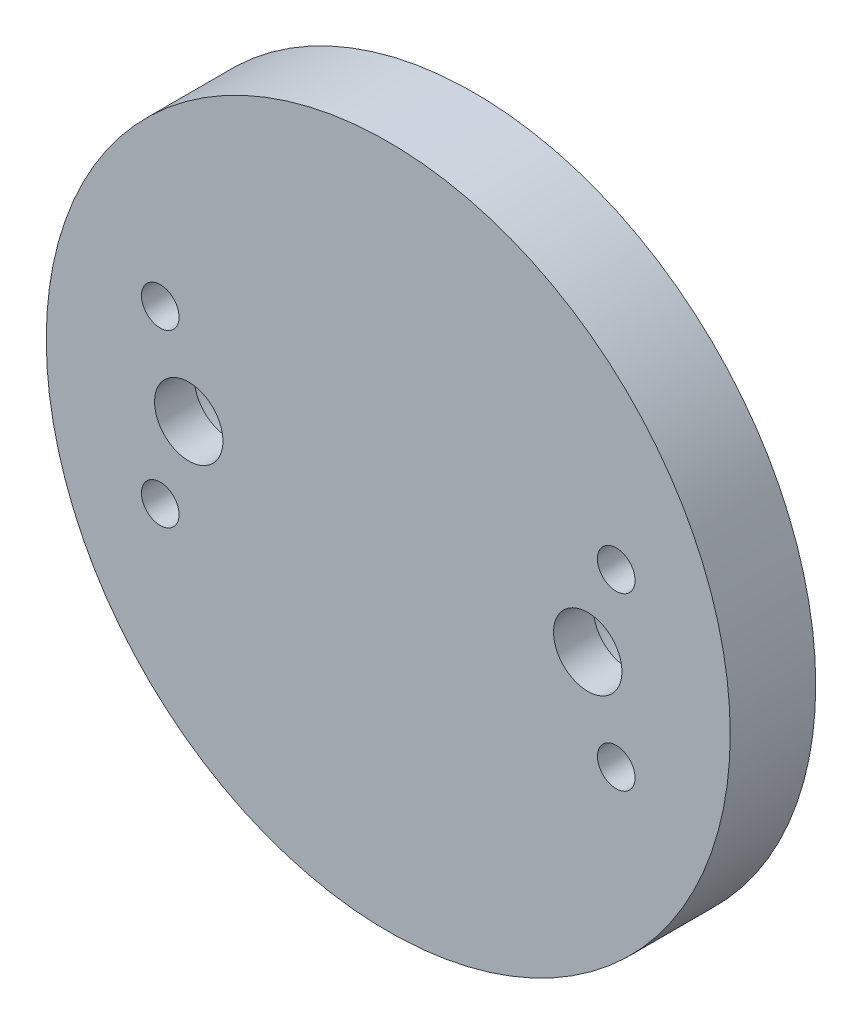
ISO-10303-21;
HEADER;
FILE_DESCRIPTION(('STEP AP214'),'2;1');
FILE_NAME('part.step','',(''),(''),'','','');
FILE_SCHEMA(('AUTOMOTIVE_DESIGN { 1 0 10303 214 1 1 1 1 }'));
ENDSEC;
DATA;
#1=APPLICATION_CONTEXT('core data for automotive mechanical design processes');
#2=APPLICATION_PROTOCOL_DEFINITION('international standard','automotive_design',2000,#1);
#3=PRODUCT_CONTEXT('',#1,'mechanical');
#4=PRODUCT('Part','Part','',(#3));
#5=PRODUCT_RELATED_PRODUCT_CATEGORY('part','',(#4));
#6=PRODUCT_DEFINITION_FORMATION('','',#4);
#7=PRODUCT_DEFINITION_CONTEXT('part definition',#1,'design');
#8=PRODUCT_DEFINITION('design','',#6,#7);
#9=PRODUCT_DEFINITION_SHAPE('','',#8);
#10=(LENGTH_UNIT() NAMED_UNIT(*) SI_UNIT(.MILLI.,.METRE.));
#11=(NAMED_UNIT(*) PLANE_ANGLE_UNIT() SI_UNIT($,.RADIAN.));
#12=(NAMED_UNIT(*) SI_UNIT($,.STERADIAN.) SOLID_ANGLE_UNIT());
#13=UNCERTAINTY_MEASURE_WITH_UNIT(LENGTH_MEASURE(1.E-05),#10,'distance_accuracy_value','');
#14=(GEOMETRIC_REPRESENTATION_CONTEXT(3) GLOBAL_UNCERTAINTY_ASSIGNED_CONTEXT((#13)) GLOBAL_UNIT_ASSIGNED_CONTEXT((#10,
#11,#12)) REPRESENTATION_CONTEXT('',''));
#15=CARTESIAN_POINT('',(0.,0.,0.));
#16=DIRECTION('',(0.,0.,1.));
#17=DIRECTION('',(1.,0.,0.));
#18=AXIS2_PLACEMENT_3D('',#15,#16,#17);
#19=CARTESIAN_POINT('',(-35.,0.,8.));
#20=DIRECTION('',(0.,0.,-1.));
#21=DIRECTION('',(-1.,0.,0.));
#22=AXIS2_PLACEMENT_3D('',#19,#20,#21);
#23=CYLINDRICAL_SURFACE('',#22,11.);
#24=CARTESIAN_POINT('',(-35.,0.,8.));
#25=DIRECTION('',(0.,0.,-1.));
#26=DIRECTION('',(-1.,0.,0.));
#27=AXIS2_PLACEMENT_3D('',#24,#25,#26);
#28=CIRCLE('',#27,11.);
#29=CARTESIAN_POINT('',(-46.,0.,8.));
#30=VERTEX_POINT('',#29);
#31=EDGE_CURVE('E136',#30,#30,#28,.T.);
#32=ORIENTED_EDGE('',*,*,#31,.F.);
#33=EDGE_LOOP('',(#32));
#34=FACE_BOUND('',#33,.T.);
#35=CARTESIAN_POINT('',(-35.,0.,7.));
#36=DIRECTION('',(0.,0.,-1.));
#37=DIRECTION('',(-1.,0.,0.));
#38=AXIS2_PLACEMENT_3D('',#35,#36,#37);
#39=CIRCLE('',#38,11.);
#40=CARTESIAN_POINT('',(-46.,0.,7.));
#41=VERTEX_POINT('',#40);
#42=EDGE_CURVE('E194',#41,#41,#39,.F.);
#43=ORIENTED_EDGE('',*,*,#42,.F.);
#44=EDGE_LOOP('',(#43));
#45=FACE_BOUND('',#44,.T.);
#46=ADVANCED_FACE('F37',(#34,#45),#23,.F.);
#47=CARTESIAN_POINT('',(35.,0.,8.));
#48=DIRECTION('',(0.,0.,-1.));
#49=DIRECTION('',(-1.,0.,0.));
#50=AXIS2_PLACEMENT_3D('',#47,#48,#49);
#51=CYLINDRICAL_SURFACE('',#50,11.);
#52=CARTESIAN_POINT('',(35.,0.,8.));
#53=DIRECTION('',(0.,0.,-1.));
#54=DIRECTION('',(-1.,0.,0.));
#55=AXIS2_PLACEMENT_3D('',#52,#53,#54);
#56=CIRCLE('',#55,11.);
#57=CARTESIAN_POINT('',(24.,0.,8.));
#58=VERTEX_POINT('',#57);
#59=EDGE_CURVE('E137',#58,#58,#56,.T.);
#60=ORIENTED_EDGE('',*,*,#59,.F.);
#61=EDGE_LOOP('',(#60));
#62=FACE_BOUND('',#61,.T.);
#63=CARTESIAN_POINT('',(35.,0.,7.));
#64=DIRECTION('',(0.,0.,-1.));
#65=DIRECTION('',(-1.,0.,0.));
#66=AXIS2_PLACEMENT_3D('',#63,#64,#65);
#67=CIRCLE('',#66,11.);
#68=CARTESIAN_POINT('',(24.,0.,7.));
#69=VERTEX_POINT('',#68);
#70=EDGE_CURVE('E167',#69,#69,#67,.F.);
#71=ORIENTED_EDGE('',*,*,#70,.F.);
#72=EDGE_LOOP('',(#71));
#73=FACE_BOUND('',#72,.T.);
#74=ADVANCED_FACE('F238',(#62,#73),#51,.F.);
#75=CARTESIAN_POINT('',(35.,0.,15.));
#76=DIRECTION('',(0.,0.,-1.));
#77=DIRECTION('',(-1.,0.,0.));
#78=AXIS2_PLACEMENT_3D('',#75,#76,#77);
#79=CYLINDRICAL_SURFACE('',#78,6.);
#80=CARTESIAN_POINT('',(35.,0.,15.));
#81=DIRECTION('',(0.,0.,-1.));
#82=DIRECTION('',(-1.,0.,0.));
#83=AXIS2_PLACEMENT_3D('',#80,#81,#82);
#84=CIRCLE('',#83,6.);
#85=CARTESIAN_POINT('',(29.,0.,15.));
#86=VERTEX_POINT('',#85);
#87=EDGE_CURVE('E145',#86,#86,#84,.T.);
#88=ORIENTED_EDGE('',*,*,#87,.F.);
#89=EDGE_LOOP('',(#88));
#90=FACE_BOUND('',#89,.T.);
#91=CARTESIAN_POINT('',(35.,0.,8.));
#92=DIRECTION('',(0.,0.,-1.));
#93=DIRECTION('',(-1.,0.,0.));
#94=AXIS2_PLACEMENT_3D('',#91,#92,#93);
#95=CIRCLE('',#94,6.);
#96=CARTESIAN_POINT('',(29.,0.,8.));
#97=VERTEX_POINT('',#96);
#98=EDGE_CURVE('E133',#97,#97,#95,.F.);
#99=ORIENTED_EDGE('',*,*,#98,.F.);
#100=EDGE_LOOP('',(#99));
#101=FACE_BOUND('',#100,.T.);
#102=ADVANCED_FACE('F245',(#90,#101),#79,.F.);
#103=CARTESIAN_POINT('',(-35.,0.,15.));
#104=DIRECTION('',(0.,0.,-1.));
#105=DIRECTION('',(-1.,0.,0.));
#106=AXIS2_PLACEMENT_3D('',#103,#104,#105);
#107=CYLINDRICAL_SURFACE('',#106,5.99999999999999);
#108=CARTESIAN_POINT('',(-35.,0.,15.));
#109=DIRECTION('',(0.,0.,-1.));
#110=DIRECTION('',(-1.,0.,0.));
#111=AXIS2_PLACEMENT_3D('',#108,#109,#110);
#112=CIRCLE('',#111,5.99999999999999);
#113=CARTESIAN_POINT('',(-41.,0.,15.));
#114=VERTEX_POINT('',#113);
#115=EDGE_CURVE('E141',#114,#114,#112,.T.);
#116=ORIENTED_EDGE('',*,*,#115,.F.);
#117=EDGE_LOOP('',(#116));
#118=FACE_BOUND('',#117,.T.);
#119=CARTESIAN_POINT('',(-35.,0.,8.));
#120=DIRECTION('',(0.,0.,-1.));
#121=DIRECTION('',(-1.,0.,0.));
#122=AXIS2_PLACEMENT_3D('',#119,#120,#121);
#123=CIRCLE('',#122,5.99999999999999);
#124=CARTESIAN_POINT('',(-41.,0.,8.));
#125=VERTEX_POINT('',#124);
#126=EDGE_CURVE('E138',#125,#125,#123,.F.);
#127=ORIENTED_EDGE('',*,*,#126,.F.);
#128=EDGE_LOOP('',(#127));
#129=FACE_BOUND('',#128,.T.);
#130=ADVANCED_FACE('F253',(#118,#129),#107,.F.);
#131=CARTESIAN_POINT('',(0.,0.,15.));
#132=DIRECTION('',(0.,0.,-1.));
#133=DIRECTION('',(-1.,0.,0.));
#134=AXIS2_PLACEMENT_3D('',#131,#132,#133);
#135=CYLINDRICAL_SURFACE('',#134,60.);
#136=CARTESIAN_POINT('',(0.,0.,15.));
#137=DIRECTION('',(0.,0.,1.));
#138=DIRECTION('',(1.,0.,0.));
#139=AXIS2_PLACEMENT_3D('',#136,#137,#138);
#140=CIRCLE('',#139,60.);
#141=CARTESIAN_POINT('',(60.,0.,15.));
#142=VERTEX_POINT('',#141);
#143=EDGE_CURVE('E130',#142,#142,#140,.T.);
#144=ORIENTED_EDGE('',*,*,#143,.F.);
#145=EDGE_LOOP('',(#144));
#146=FACE_BOUND('',#145,.T.);
#147=CARTESIAN_POINT('',(0.,0.,0.));
#148=DIRECTION('',(0.,0.,1.));
#149=DIRECTION('',(1.,0.,0.));
#150=AXIS2_PLACEMENT_3D('',#147,#148,#149);
#151=CIRCLE('',#150,60.);
#152=CARTESIAN_POINT('',(60.,0.,0.));
#153=VERTEX_POINT('',#152);
#154=EDGE_CURVE('E142',#153,#153,#151,.T.);
#155=ORIENTED_EDGE('',*,*,#154,.T.);
#156=EDGE_LOOP('',(#155));
#157=FACE_BOUND('',#156,.T.);
#158=ADVANCED_FACE('F39',(#146,#157),#135,.T.);
#159=CARTESIAN_POINT('',(0.,0.,15.));
#160=DIRECTION('',(0.,0.,1.));
#161=DIRECTION('',(1.,0.,0.));
#162=AXIS2_PLACEMENT_3D('',#159,#160,#161);
#163=PLANE('',#162);
#164=CARTESIAN_POINT('',(-40.,15.,15.));
#165=DIRECTION('',(0.,0.,1.));
#166=DIRECTION('',(1.,0.,0.));
#167=AXIS2_PLACEMENT_3D('',#164,#165,#166);
#168=CIRCLE('',#167,3.3);
#169=CARTESIAN_POINT('',(-36.7,15.,15.));
#170=VERTEX_POINT('',#169);
#171=EDGE_CURVE('E163',#170,#170,#168,.T.);
#172=ORIENTED_EDGE('',*,*,#171,.F.);
#173=EDGE_LOOP('',(#172));
#174=FACE_BOUND('',#173,.T.);
#175=CARTESIAN_POINT('',(-40.,-15.,15.));
#176=DIRECTION('',(0.,0.,1.));
#177=DIRECTION('',(1.,0.,0.));
#178=AXIS2_PLACEMENT_3D('',#175,#176,#177);
#179=CIRCLE('',#178,3.3);
#180=CARTESIAN_POINT('',(-36.7,-15.,15.));
#181=VERTEX_POINT('',#180);
#182=EDGE_CURVE('E169',#181,#181,#179,.T.);
#183=ORIENTED_EDGE('',*,*,#182,.F.);
#184=EDGE_LOOP('',(#183));
#185=FACE_BOUND('',#184,.T.);
#186=CARTESIAN_POINT('',(40.,-15.,15.));
#187=DIRECTION('',(0.,0.,1.));
#188=DIRECTION('',(1.,0.,0.));
#189=AXIS2_PLACEMENT_3D('',#186,#187,#188);
#190=CIRCLE('',#189,3.3);
#191=CARTESIAN_POINT('',(43.3,-15.,15.));
#192=VERTEX_POINT('',#191);
#193=EDGE_CURVE('E175',#192,#192,#190,.T.);
#194=ORIENTED_EDGE('',*,*,#193,.F.);
#195=EDGE_LOOP('',(#194));
#196=FACE_BOUND('',#195,.T.);
#197=CARTESIAN_POINT('',(40.,15.,15.));
#198=DIRECTION('',(0.,0.,1.));
#199=DIRECTION('',(1.,0.,0.));
#200=AXIS2_PLACEMENT_3D('',#197,#198,#199);
#201=CIRCLE('',#200,3.3);
#202=CARTESIAN_POINT('',(43.3,15.,15.));
#203=VERTEX_POINT('',#202);
#204=EDGE_CURVE('E157',#203,#203,#201,.T.);
#205=ORIENTED_EDGE('',*,*,#204,.F.);
#206=EDGE_LOOP('',(#205));
#207=FACE_BOUND('',#206,.T.);
#208=ORIENTED_EDGE('',*,*,#115,.T.);
#209=EDGE_LOOP('',(#208));
#210=FACE_BOUND('',#209,.T.);
#211=ORIENTED_EDGE('',*,*,#87,.T.);
#212=EDGE_LOOP('',(#211));
#213=FACE_BOUND('',#212,.T.);
#214=ORIENTED_EDGE('',*,*,#143,.T.);
#215=EDGE_LOOP('',(#214));
#216=FACE_BOUND('',#215,.T.);
#217=ADVANCED_FACE('F260',(#174,#185,#196,#207,#210,#213,#216),#163,.T.);
#218=CARTESIAN_POINT('',(0.,0.,0.));
#219=DIRECTION('',(0.,0.,1.));
#220=DIRECTION('',(1.,0.,0.));
#221=AXIS2_PLACEMENT_3D('',#218,#219,#220);
#222=PLANE('',#221);
#223=CARTESIAN_POINT('',(-35.0000000000002,0.,0.));
#224=DIRECTION('',(0.,0.,-1.));
#225=DIRECTION('',(-1.,0.,0.));
#226=AXIS2_PLACEMENT_3D('',#223,#224,#225);
#227=CIRCLE('',#226,14.);
#228=CARTESIAN_POINT('',(-49.0000000000002,0.,0.));
#229=VERTEX_POINT('',#228);
#230=EDGE_CURVE('E124',#229,#229,#227,.T.);
#231=ORIENTED_EDGE('',*,*,#230,.F.);
#232=EDGE_LOOP('',(#231));
#233=FACE_BOUND('',#232,.T.);
#234=CARTESIAN_POINT('',(35.00000000001,9.89182998508053E-13,0.));
#235=DIRECTION('',(0.,0.,-1.));
#236=DIRECTION('',(-1.,0.,0.));
#237=AXIS2_PLACEMENT_3D('',#234,#235,#236);
#238=CIRCLE('',#237,14.0000000000093);
#239=CARTESIAN_POINT('',(21.0000000000007,9.89182998508053E-13,0.));
#240=VERTEX_POINT('',#239);
#241=EDGE_CURVE('E206',#240,#240,#238,.T.);
#242=ORIENTED_EDGE('',*,*,#241,.F.);
#243=EDGE_LOOP('',(#242));
#244=FACE_BOUND('',#243,.T.);
#245=ORIENTED_EDGE('',*,*,#154,.F.);
#246=EDGE_LOOP('',(#245));
#247=FACE_BOUND('',#246,.T.);
#248=ADVANCED_FACE('F262',(#233,#244,#247),#222,.F.);
#249=CARTESIAN_POINT('',(-35.,0.,8.));
#250=DIRECTION('',(0.,0.,-1.));
#251=DIRECTION('',(-1.,0.,0.));
#252=AXIS2_PLACEMENT_3D('',#249,#250,#251);
#253=PLANE('',#252);
#254=ORIENTED_EDGE('',*,*,#31,.T.);
#255=EDGE_LOOP('',(#254));
#256=FACE_BOUND('',#255,.T.);
#257=ORIENTED_EDGE('',*,*,#126,.T.);
#258=EDGE_LOOP('',(#257));
#259=FACE_BOUND('',#258,.T.);
#260=ADVANCED_FACE('F252',(#256,#259),#253,.T.);
#261=CARTESIAN_POINT('',(35.,0.,8.));
#262=DIRECTION('',(0.,0.,-1.));
#263=DIRECTION('',(-1.,0.,0.));
#264=AXIS2_PLACEMENT_3D('',#261,#262,#263);
#265=PLANE('',#264);
#266=ORIENTED_EDGE('',*,*,#59,.T.);
#267=EDGE_LOOP('',(#266));
#268=FACE_BOUND('',#267,.T.);
#269=ORIENTED_EDGE('',*,*,#98,.T.);
#270=EDGE_LOOP('',(#269));
#271=FACE_BOUND('',#270,.T.);
#272=ADVANCED_FACE('F270',(#268,#271),#265,.T.);
#273=CARTESIAN_POINT('',(40.,15.,5.));
#274=DIRECTION('',(0.,0.,1.));
#275=DIRECTION('',(1.,0.,0.));
#276=AXIS2_PLACEMENT_3D('',#273,#274,#275);
#277=CYLINDRICAL_SURFACE('',#276,3.3);
#278=CARTESIAN_POINT('',(40.,15.,5.));
#279=DIRECTION('',(0.,0.,1.));
#280=DIRECTION('',(1.,0.,0.));
#281=AXIS2_PLACEMENT_3D('',#278,#279,#280);
#282=CIRCLE('',#281,3.3);
#283=CARTESIAN_POINT('',(41.8029073150372,12.2360308950017,5.));
#284=VERTEX_POINT('',#283);
#285=CARTESIAN_POINT('',(36.8992926849726,13.87056910502,5.));
#286=VERTEX_POINT('',#285);
#287=EDGE_CURVE('E156',#284,#286,#282,.T.);
#288=ORIENTED_EDGE('',*,*,#287,.F.);
#289=DIRECTION('',(0.,0.,-1.));
#290=VECTOR('',#289,1.);
#291=CARTESIAN_POINT('',(41.8029073150372,12.2360308950017,3.5));
#292=LINE('',#291,#290);
#293=CARTESIAN_POINT('',(41.8029073150372,12.2360308950017,7.));
#294=VERTEX_POINT('',#293);
#295=EDGE_CURVE('E52',#284,#294,#292,.F.);
#296=ORIENTED_EDGE('',*,*,#295,.T.);
#297=CARTESIAN_POINT('',(40.,15.,7.));
#298=DIRECTION('',(0.,0.,-1.));
#299=DIRECTION('',(-1.,0.,0.));
#300=AXIS2_PLACEMENT_3D('',#297,#298,#299);
#301=CIRCLE('',#300,3.3);
#302=CARTESIAN_POINT('',(36.8992926849725,13.87056910502,7.));
#303=VERTEX_POINT('',#302);
#304=EDGE_CURVE('E182',#303,#294,#301,.F.);
#305=ORIENTED_EDGE('',*,*,#304,.F.);
#306=DIRECTION('',(0.,0.,-1.));
#307=VECTOR('',#306,1.);
#308=CARTESIAN_POINT('',(36.8992926849726,13.87056910502,3.5));
#309=LINE('',#308,#307);
#310=EDGE_CURVE('E185',#303,#286,#309,.T.);
#311=ORIENTED_EDGE('',*,*,#310,.T.);
#312=EDGE_LOOP('',(#288,#296,#305,#311));
#313=FACE_BOUND('',#312,.T.);
#314=ORIENTED_EDGE('',*,*,#204,.T.);
#315=EDGE_LOOP('',(#314));
#316=FACE_BOUND('',#315,.T.);
#317=ADVANCED_FACE('F304',(#313,#316),#277,.F.);
#318=CARTESIAN_POINT('',(40.,15.,5.));
#319=DIRECTION('',(0.,0.,1.));
#320=DIRECTION('',(1.,0.,0.));
#321=AXIS2_PLACEMENT_3D('',#318,#319,#320);
#322=PLANE('',#321);
#323=CARTESIAN_POINT('',(35.00000000001,9.89182998508053E-13,5.));
#324=DIRECTION('',(0.,0.,1.));
#325=DIRECTION('',(1.,0.,0.));
#326=AXIS2_PLACEMENT_3D('',#323,#324,#325);
#327=CIRCLE('',#326,14.0000000000093);
#328=EDGE_CURVE('E188',#284,#286,#327,.T.);
#329=ORIENTED_EDGE('',*,*,#328,.F.);
#330=ORIENTED_EDGE('',*,*,#287,.T.);
#331=EDGE_LOOP('',(#329,#330));
#332=FACE_BOUND('',#331,.T.);
#333=ADVANCED_FACE('F312',(#332),#322,.T.);
#334=CARTESIAN_POINT('',(40.,-15.,5.));
#335=DIRECTION('',(0.,0.,1.));
#336=DIRECTION('',(1.,0.,0.));
#337=AXIS2_PLACEMENT_3D('',#334,#335,#336);
#338=CYLINDRICAL_SURFACE('',#337,3.3);
#339=CARTESIAN_POINT('',(40.,-15.,5.));
#340=DIRECTION('',(0.,0.,1.));
#341=DIRECTION('',(1.,0.,0.));
#342=AXIS2_PLACEMENT_3D('',#339,#340,#341);
#343=CIRCLE('',#342,3.3);
#344=CARTESIAN_POINT('',(36.8992926849733,-13.870569105018,5.));
#345=VERTEX_POINT('',#344);
#346=CARTESIAN_POINT('',(41.8029073150356,-12.2360308950006,5.));
#347=VERTEX_POINT('',#346);
#348=EDGE_CURVE('E160',#345,#347,#343,.T.);
#349=ORIENTED_EDGE('',*,*,#348,.F.);
#350=DIRECTION('',(0.,0.,-1.));
#351=VECTOR('',#350,1.);
#352=CARTESIAN_POINT('',(36.8992926849733,-13.870569105018,3.5));
#353=LINE('',#352,#351);
#354=CARTESIAN_POINT('',(36.8992926849733,-13.870569105018,7.));
#355=VERTEX_POINT('',#354);
#356=EDGE_CURVE('E59',#345,#355,#353,.F.);
#357=ORIENTED_EDGE('',*,*,#356,.T.);
#358=CARTESIAN_POINT('',(40.,-15.,7.));
#359=DIRECTION('',(0.,0.,-1.));
#360=DIRECTION('',(-1.,0.,0.));
#361=AXIS2_PLACEMENT_3D('',#358,#359,#360);
#362=CIRCLE('',#361,3.3);
#363=CARTESIAN_POINT('',(41.8029073150356,-12.2360308950006,7.));
#364=VERTEX_POINT('',#363);
#365=EDGE_CURVE('E11',#364,#355,#362,.F.);
#366=ORIENTED_EDGE('',*,*,#365,.F.);
#367=DIRECTION('',(0.,0.,-1.));
#368=VECTOR('',#367,1.);
#369=CARTESIAN_POINT('',(41.8029073150356,-12.2360308950006,3.5));
#370=LINE('',#369,#368);
#371=EDGE_CURVE('E191',#364,#347,#370,.T.);
#372=ORIENTED_EDGE('',*,*,#371,.T.);
#373=EDGE_LOOP('',(#349,#357,#366,#372));
#374=FACE_BOUND('',#373,.T.);
#375=ORIENTED_EDGE('',*,*,#193,.T.);
#376=EDGE_LOOP('',(#375));
#377=FACE_BOUND('',#376,.T.);
#378=ADVANCED_FACE('F224',(#374,#377),#338,.F.);
#379=CARTESIAN_POINT('',(40.,-15.,5.));
#380=DIRECTION('',(0.,0.,1.));
#381=DIRECTION('',(1.,0.,0.));
#382=AXIS2_PLACEMENT_3D('',#379,#380,#381);
#383=PLANE('',#382);
#384=CARTESIAN_POINT('',(35.00000000001,9.89182998508053E-13,5.));
#385=DIRECTION('',(0.,0.,1.));
#386=DIRECTION('',(1.,0.,0.));
#387=AXIS2_PLACEMENT_3D('',#384,#385,#386);
#388=CIRCLE('',#387,14.0000000000093);
#389=EDGE_CURVE('E45',#345,#347,#388,.T.);
#390=ORIENTED_EDGE('',*,*,#389,.F.);
#391=ORIENTED_EDGE('',*,*,#348,.T.);
#392=EDGE_LOOP('',(#390,#391));
#393=FACE_BOUND('',#392,.T.);
#394=ADVANCED_FACE('F227',(#393),#383,.T.);
#395=CARTESIAN_POINT('',(-40.,-15.,5.));
#396=DIRECTION('',(0.,0.,1.));
#397=DIRECTION('',(1.,0.,0.));
#398=AXIS2_PLACEMENT_3D('',#395,#396,#397);
#399=CYLINDRICAL_SURFACE('',#398,3.3);
#400=CARTESIAN_POINT('',(-40.,-15.,5.));
#401=DIRECTION('',(0.,0.,1.));
#402=DIRECTION('',(1.,0.,0.));
#403=AXIS2_PLACEMENT_3D('',#400,#401,#402);
#404=CIRCLE('',#403,3.3);
#405=CARTESIAN_POINT('',(-41.802907315023,-12.2360308949924,5.));
#406=VERTEX_POINT('',#405);
#407=CARTESIAN_POINT('',(-36.8992926849771,-13.8705691050076,5.));
#408=VERTEX_POINT('',#407);
#409=EDGE_CURVE('E172',#406,#408,#404,.T.);
#410=ORIENTED_EDGE('',*,*,#409,.F.);
#411=DIRECTION('',(0.,0.,-1.));
#412=VECTOR('',#411,1.);
#413=CARTESIAN_POINT('',(-41.802907315023,-12.2360308949924,3.5));
#414=LINE('',#413,#412);
#415=CARTESIAN_POINT('',(-41.802907315023,-12.2360308949924,7.));
#416=VERTEX_POINT('',#415);
#417=EDGE_CURVE('E198',#406,#416,#414,.F.);
#418=ORIENTED_EDGE('',*,*,#417,.T.);
#419=CARTESIAN_POINT('',(-40.,-15.,7.));
#420=DIRECTION('',(0.,0.,-1.));
#421=DIRECTION('',(-1.,0.,0.));
#422=AXIS2_PLACEMENT_3D('',#419,#420,#421);
#423=CIRCLE('',#422,3.3);
#424=CARTESIAN_POINT('',(-36.8992926849771,-13.8705691050076,7.));
#425=VERTEX_POINT('',#424);
#426=EDGE_CURVE('E123',#425,#416,#423,.F.);
#427=ORIENTED_EDGE('',*,*,#426,.F.);
#428=DIRECTION('',(0.,0.,-1.));
#429=VECTOR('',#428,1.);
#430=CARTESIAN_POINT('',(-36.8992926849771,-13.8705691050076,3.5));
#431=LINE('',#430,#429);
#432=EDGE_CURVE('E200',#425,#408,#431,.T.);
#433=ORIENTED_EDGE('',*,*,#432,.T.);
#434=EDGE_LOOP('',(#410,#418,#427,#433));
#435=FACE_BOUND('',#434,.T.);
#436=ORIENTED_EDGE('',*,*,#182,.T.);
#437=EDGE_LOOP('',(#436));
#438=FACE_BOUND('',#437,.T.);
#439=ADVANCED_FACE('F339',(#435,#438),#399,.F.);
#440=CARTESIAN_POINT('',(-40.,-15.,5.));
#441=DIRECTION('',(0.,0.,1.));
#442=DIRECTION('',(1.,0.,0.));
#443=AXIS2_PLACEMENT_3D('',#440,#441,#442);
#444=PLANE('',#443);
#445=CARTESIAN_POINT('',(-35.0000000000002,0.,5.));
#446=DIRECTION('',(0.,0.,1.));
#447=DIRECTION('',(1.,0.,0.));
#448=AXIS2_PLACEMENT_3D('',#445,#446,#447);
#449=CIRCLE('',#448,14.);
#450=EDGE_CURVE('E203',#406,#408,#449,.T.);
#451=ORIENTED_EDGE('',*,*,#450,.F.);
#452=ORIENTED_EDGE('',*,*,#409,.T.);
#453=EDGE_LOOP('',(#451,#452));
#454=FACE_BOUND('',#453,.T.);
#455=ADVANCED_FACE('F347',(#454),#444,.T.);
#456=CARTESIAN_POINT('',(-40.,15.,5.));
#457=DIRECTION('',(0.,0.,1.));
#458=DIRECTION('',(1.,0.,0.));
#459=AXIS2_PLACEMENT_3D('',#456,#457,#458);
#460=CYLINDRICAL_SURFACE('',#459,3.3);
#461=CARTESIAN_POINT('',(-40.,15.,5.));
#462=DIRECTION('',(0.,0.,1.));
#463=DIRECTION('',(1.,0.,0.));
#464=AXIS2_PLACEMENT_3D('',#461,#462,#463);
#465=CIRCLE('',#464,3.3);
#466=CARTESIAN_POINT('',(-36.899292684977,13.8705691050078,5.));
#467=VERTEX_POINT('',#466);
#468=CARTESIAN_POINT('',(-41.8029073150231,12.2360308949925,5.));
#469=VERTEX_POINT('',#468);
#470=EDGE_CURVE('E166',#467,#469,#465,.T.);
#471=ORIENTED_EDGE('',*,*,#470,.F.);
#472=DIRECTION('',(0.,0.,-1.));
#473=VECTOR('',#472,1.);
#474=CARTESIAN_POINT('',(-36.899292684977,13.8705691050078,3.5));
#475=LINE('',#474,#473);
#476=CARTESIAN_POINT('',(-36.899292684977,13.8705691050078,7.));
#477=VERTEX_POINT('',#476);
#478=EDGE_CURVE('E113',#467,#477,#475,.F.);
#479=ORIENTED_EDGE('',*,*,#478,.T.);
#480=CARTESIAN_POINT('',(-40.,15.,7.));
#481=DIRECTION('',(0.,0.,-1.));
#482=DIRECTION('',(-1.,0.,0.));
#483=AXIS2_PLACEMENT_3D('',#480,#481,#482);
#484=CIRCLE('',#483,3.3);
#485=CARTESIAN_POINT('',(-41.8029073150231,12.2360308949925,7.));
#486=VERTEX_POINT('',#485);
#487=EDGE_CURVE('E120',#486,#477,#484,.F.);
#488=ORIENTED_EDGE('',*,*,#487,.F.);
#489=DIRECTION('',(0.,0.,-1.));
#490=VECTOR('',#489,1.);
#491=CARTESIAN_POINT('',(-41.8029073150231,12.2360308949925,3.5));
#492=LINE('',#491,#490);
#493=EDGE_CURVE('E102',#486,#469,#492,.T.);
#494=ORIENTED_EDGE('',*,*,#493,.T.);
#495=EDGE_LOOP('',(#471,#479,#488,#494));
#496=FACE_BOUND('',#495,.T.);
#497=ORIENTED_EDGE('',*,*,#171,.T.);
#498=EDGE_LOOP('',(#497));
#499=FACE_BOUND('',#498,.T.);
#500=ADVANCED_FACE('F127',(#496,#499),#460,.F.);
#501=CARTESIAN_POINT('',(-40.,15.,5.));
#502=DIRECTION('',(0.,0.,1.));
#503=DIRECTION('',(1.,0.,0.));
#504=AXIS2_PLACEMENT_3D('',#501,#502,#503);
#505=PLANE('',#504);
#506=CARTESIAN_POINT('',(-35.0000000000002,0.,5.));
#507=DIRECTION('',(0.,0.,1.));
#508=DIRECTION('',(1.,0.,0.));
#509=AXIS2_PLACEMENT_3D('',#506,#507,#508);
#510=CIRCLE('',#509,14.);
#511=EDGE_CURVE('E108',#467,#469,#510,.T.);
#512=ORIENTED_EDGE('',*,*,#511,.F.);
#513=ORIENTED_EDGE('',*,*,#470,.T.);
#514=EDGE_LOOP('',(#512,#513));
#515=FACE_BOUND('',#514,.T.);
#516=ADVANCED_FACE('F366',(#515),#505,.T.);
#517=CARTESIAN_POINT('',(-35.0000000000002,0.,7.));
#518=DIRECTION('',(0.,0.,-1.));
#519=DIRECTION('',(-1.,0.,0.));
#520=AXIS2_PLACEMENT_3D('',#517,#518,#519);
#521=PLANE('',#520);
#522=ORIENTED_EDGE('',*,*,#426,.T.);
#523=CARTESIAN_POINT('',(-35.0000000000002,0.,7.));
#524=DIRECTION('',(0.,0.,-1.));
#525=DIRECTION('',(-1.,0.,0.));
#526=AXIS2_PLACEMENT_3D('',#523,#524,#525);
#527=CIRCLE('',#526,14.);
#528=EDGE_CURVE('E105',#416,#486,#527,.T.);
#529=ORIENTED_EDGE('',*,*,#528,.T.);
#530=ORIENTED_EDGE('',*,*,#487,.T.);
#531=EDGE_CURVE('E114',#477,#425,#527,.T.);
#532=ORIENTED_EDGE('',*,*,#531,.T.);
#533=EDGE_LOOP('',(#522,#529,#530,#532));
#534=FACE_BOUND('',#533,.T.);
#535=ORIENTED_EDGE('',*,*,#42,.T.);
#536=EDGE_LOOP('',(#535));
#537=FACE_BOUND('',#536,.T.);
#538=ADVANCED_FACE('F117',(#534,#537),#521,.T.);
#539=CARTESIAN_POINT('',(-35.0000000000002,0.,7.));
#540=DIRECTION('',(0.,0.,-1.));
#541=DIRECTION('',(-1.,0.,0.));
#542=AXIS2_PLACEMENT_3D('',#539,#540,#541);
#543=CYLINDRICAL_SURFACE('',#542,14.);
#544=ORIENTED_EDGE('',*,*,#230,.T.);
#545=EDGE_LOOP('',(#544));
#546=FACE_BOUND('',#545,.T.);
#547=ORIENTED_EDGE('',*,*,#450,.T.);
#548=ORIENTED_EDGE('',*,*,#432,.F.);
#549=ORIENTED_EDGE('',*,*,#531,.F.);
#550=ORIENTED_EDGE('',*,*,#478,.F.);
#551=ORIENTED_EDGE('',*,*,#511,.T.);
#552=ORIENTED_EDGE('',*,*,#493,.F.);
#553=ORIENTED_EDGE('',*,*,#528,.F.);
#554=ORIENTED_EDGE('',*,*,#417,.F.);
#555=EDGE_LOOP('',(#547,#548,#549,#550,#551,#552,#553,#554));
#556=FACE_BOUND('',#555,.T.);
#557=ADVANCED_FACE('F104',(#546,#556),#543,.F.);
#558=CARTESIAN_POINT('',(35.00000000001,9.89182998508053E-13,7.));
#559=DIRECTION('',(0.,0.,-1.));
#560=DIRECTION('',(-1.,0.,0.));
#561=AXIS2_PLACEMENT_3D('',#558,#559,#560);
#562=PLANE('',#561);
#563=ORIENTED_EDGE('',*,*,#304,.T.);
#564=CARTESIAN_POINT('',(35.00000000001,9.89182998508053E-13,7.));
#565=DIRECTION('',(0.,0.,-1.));
#566=DIRECTION('',(-1.,0.,0.));
#567=AXIS2_PLACEMENT_3D('',#564,#565,#566);
#568=CIRCLE('',#567,14.0000000000093);
#569=EDGE_CURVE('E212',#294,#364,#568,.T.);
#570=ORIENTED_EDGE('',*,*,#569,.T.);
#571=ORIENTED_EDGE('',*,*,#365,.T.);
#572=EDGE_CURVE('E209',#355,#303,#568,.T.);
#573=ORIENTED_EDGE('',*,*,#572,.T.);
#574=EDGE_LOOP('',(#563,#570,#571,#573));
#575=FACE_BOUND('',#574,.T.);
#576=ORIENTED_EDGE('',*,*,#70,.T.);
#577=EDGE_LOOP('',(#576));
#578=FACE_BOUND('',#577,.T.);
#579=ADVANCED_FACE('F219',(#575,#578),#562,.T.);
#580=CARTESIAN_POINT('',(35.00000000001,9.89182998508053E-13,7.));
#581=DIRECTION('',(0.,0.,-1.));
#582=DIRECTION('',(-1.,0.,0.));
#583=AXIS2_PLACEMENT_3D('',#580,#581,#582);
#584=CYLINDRICAL_SURFACE('',#583,14.0000000000093);
#585=ORIENTED_EDGE('',*,*,#241,.T.);
#586=EDGE_LOOP('',(#585));
#587=FACE_BOUND('',#586,.T.);
#588=ORIENTED_EDGE('',*,*,#328,.T.);
#589=ORIENTED_EDGE('',*,*,#310,.F.);
#590=ORIENTED_EDGE('',*,*,#572,.F.);
#591=ORIENTED_EDGE('',*,*,#356,.F.);
#592=ORIENTED_EDGE('',*,*,#389,.T.);
#593=ORIENTED_EDGE('',*,*,#371,.F.);
#594=ORIENTED_EDGE('',*,*,#569,.F.);
#595=ORIENTED_EDGE('',*,*,#295,.F.);
#596=EDGE_LOOP('',(#588,#589,#590,#591,#592,#593,#594,#595));
#597=FACE_BOUND('',#596,.T.);
#598=ADVANCED_FACE('F228',(#587,#597),#584,.F.);
#599=CLOSED_SHELL('',(#46,#74,#102,#130,#158,#217,#248,#260,#272,#317,#333,#378,#394,#439,#455,
#500,#516,#538,#557,#579,#598));
#600=MANIFOLD_SOLID_BREP('B2',#599);
#601=ADVANCED_BREP_SHAPE_REPRESENTATION('',(#18,#600),#14);
#602=SHAPE_DEFINITION_REPRESENTATION(#9,#601);
ENDSEC;
END-ISO-10303-21;
